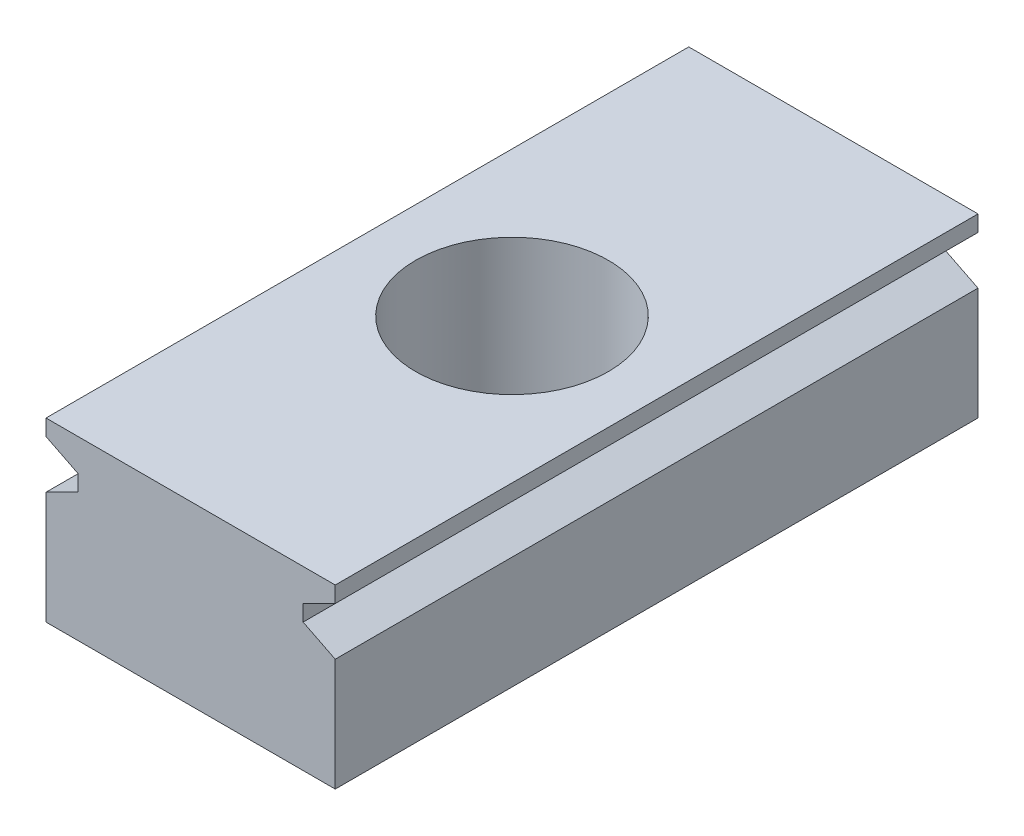
ISO-10303-21;
HEADER;
FILE_DESCRIPTION(('STEP AP214'),'2;1');
FILE_NAME('part.step','',(''),(''),'','','');
FILE_SCHEMA(('AUTOMOTIVE_DESIGN { 1 0 10303 214 1 1 1 1 }'));
ENDSEC;
DATA;
#1=APPLICATION_CONTEXT('core data for automotive mechanical design processes');
#2=APPLICATION_PROTOCOL_DEFINITION('international standard','automotive_design',2000,#1);
#3=PRODUCT_CONTEXT('',#1,'mechanical');
#4=PRODUCT('Part','Part','',(#3));
#5=PRODUCT_RELATED_PRODUCT_CATEGORY('part','',(#4));
#6=PRODUCT_DEFINITION_FORMATION('','',#4);
#7=PRODUCT_DEFINITION_CONTEXT('part definition',#1,'design');
#8=PRODUCT_DEFINITION('design','',#6,#7);
#9=PRODUCT_DEFINITION_SHAPE('','',#8);
#10=(LENGTH_UNIT() NAMED_UNIT(*) SI_UNIT(.MILLI.,.METRE.));
#11=(NAMED_UNIT(*) PLANE_ANGLE_UNIT() SI_UNIT($,.RADIAN.));
#12=(NAMED_UNIT(*) SI_UNIT($,.STERADIAN.) SOLID_ANGLE_UNIT());
#13=UNCERTAINTY_MEASURE_WITH_UNIT(LENGTH_MEASURE(1.E-05),#10,'distance_accuracy_value','');
#14=(GEOMETRIC_REPRESENTATION_CONTEXT(3) GLOBAL_UNCERTAINTY_ASSIGNED_CONTEXT((#13)) GLOBAL_UNIT_ASSIGNED_CONTEXT((#10,
#11,#12)) REPRESENTATION_CONTEXT('',''));
#15=CARTESIAN_POINT('',(0.,0.,0.));
#16=DIRECTION('',(0.,0.,1.));
#17=DIRECTION('',(1.,0.,0.));
#18=AXIS2_PLACEMENT_3D('',#15,#16,#17);
#19=CARTESIAN_POINT('',(-4.5,3.5,20.));
#20=DIRECTION('',(1.,0.,0.));
#21=DIRECTION('',(0.,1.,0.));
#22=AXIS2_PLACEMENT_3D('',#19,#20,#21);
#23=PLANE('',#22);
#24=DIRECTION('',(0.,-1.,0.));
#25=VECTOR('',#24,1.);
#26=CARTESIAN_POINT('',(-4.5,3.5,0.));
#27=LINE('',#26,#25);
#28=CARTESIAN_POINT('',(-4.5,3.5,0.));
#29=VERTEX_POINT('',#28);
#30=CARTESIAN_POINT('',(-4.5,0.,0.));
#31=VERTEX_POINT('',#30);
#32=EDGE_CURVE('E153',#29,#31,#27,.T.);
#33=ORIENTED_EDGE('',*,*,#32,.T.);
#34=DIRECTION('',(0.,0.,-1.));
#35=VECTOR('',#34,1.);
#36=CARTESIAN_POINT('',(-4.5,0.,20.));
#37=LINE('',#36,#35);
#38=CARTESIAN_POINT('',(-4.5,0.,20.));
#39=VERTEX_POINT('',#38);
#40=EDGE_CURVE('E11',#39,#31,#37,.T.);
#41=ORIENTED_EDGE('',*,*,#40,.F.);
#42=DIRECTION('',(0.,-1.,0.));
#43=VECTOR('',#42,1.);
#44=CARTESIAN_POINT('',(-4.5,3.5,20.));
#45=LINE('',#44,#43);
#46=CARTESIAN_POINT('',(-4.5,3.5,20.));
#47=VERTEX_POINT('',#46);
#48=EDGE_CURVE('E176',#47,#39,#45,.T.);
#49=ORIENTED_EDGE('',*,*,#48,.F.);
#50=DIRECTION('',(0.,0.,-1.));
#51=VECTOR('',#50,1.);
#52=CARTESIAN_POINT('',(-4.5,3.5,20.));
#53=LINE('',#52,#51);
#54=EDGE_CURVE('E149',#47,#29,#53,.T.);
#55=ORIENTED_EDGE('',*,*,#54,.T.);
#56=EDGE_LOOP('',(#33,#41,#49,#55));
#57=FACE_BOUND('',#56,.T.);
#58=ADVANCED_FACE('F33',(#57),#23,.F.);
#59=CARTESIAN_POINT('',(-4.5,0.,20.));
#60=DIRECTION('',(0.,1.,0.));
#61=DIRECTION('',(-1.,0.,0.));
#62=AXIS2_PLACEMENT_3D('',#59,#60,#61);
#63=PLANE('',#62);
#64=CARTESIAN_POINT('',(0.,0.,10.));
#65=DIRECTION('',(0.,1.,0.));
#66=DIRECTION('',(-1.,0.,0.));
#67=AXIS2_PLACEMENT_3D('',#64,#65,#66);
#68=CIRCLE('',#67,1.75);
#69=CARTESIAN_POINT('',(-1.74999999999999,0.,10.));
#70=VERTEX_POINT('',#69);
#71=EDGE_CURVE('E358',#70,#70,#68,.T.);
#72=ORIENTED_EDGE('',*,*,#71,.T.);
#73=EDGE_LOOP('',(#72));
#74=FACE_BOUND('',#73,.T.);
#75=DIRECTION('',(1.,0.,0.));
#76=VECTOR('',#75,1.);
#77=CARTESIAN_POINT('',(-4.5,0.,0.));
#78=LINE('',#77,#76);
#79=CARTESIAN_POINT('',(4.5,0.,0.));
#80=VERTEX_POINT('',#79);
#81=EDGE_CURVE('E156',#31,#80,#78,.T.);
#82=ORIENTED_EDGE('',*,*,#81,.T.);
#83=DIRECTION('',(0.,0.,-1.));
#84=VECTOR('',#83,1.);
#85=CARTESIAN_POINT('',(4.5,0.,20.));
#86=LINE('',#85,#84);
#87=CARTESIAN_POINT('',(4.5,0.,20.));
#88=VERTEX_POINT('',#87);
#89=EDGE_CURVE('E41',#88,#80,#86,.T.);
#90=ORIENTED_EDGE('',*,*,#89,.F.);
#91=DIRECTION('',(1.,0.,0.));
#92=VECTOR('',#91,1.);
#93=CARTESIAN_POINT('',(-4.5,0.,20.));
#94=LINE('',#93,#92);
#95=EDGE_CURVE('E104',#39,#88,#94,.T.);
#96=ORIENTED_EDGE('',*,*,#95,.F.);
#97=ORIENTED_EDGE('',*,*,#40,.T.);
#98=EDGE_LOOP('',(#82,#90,#96,#97));
#99=FACE_BOUND('',#98,.T.);
#100=ADVANCED_FACE('F254',(#74,#99),#63,.F.);
#101=CARTESIAN_POINT('',(4.5,0.,20.));
#102=DIRECTION('',(-1.,0.,0.));
#103=DIRECTION('',(0.,-1.,0.));
#104=AXIS2_PLACEMENT_3D('',#101,#102,#103);
#105=PLANE('',#104);
#106=DIRECTION('',(0.,1.,0.));
#107=VECTOR('',#106,1.);
#108=CARTESIAN_POINT('',(4.5,0.,0.));
#109=LINE('',#108,#107);
#110=CARTESIAN_POINT('',(4.5,3.5,0.));
#111=VERTEX_POINT('',#110);
#112=EDGE_CURVE('E159',#80,#111,#109,.T.);
#113=ORIENTED_EDGE('',*,*,#112,.T.);
#114=DIRECTION('',(0.,0.,-1.));
#115=VECTOR('',#114,1.);
#116=CARTESIAN_POINT('',(4.5,3.5,20.));
#117=LINE('',#116,#115);
#118=CARTESIAN_POINT('',(4.5,3.5,20.));
#119=VERTEX_POINT('',#118);
#120=EDGE_CURVE('E195',#119,#111,#117,.T.);
#121=ORIENTED_EDGE('',*,*,#120,.F.);
#122=DIRECTION('',(0.,1.,0.));
#123=VECTOR('',#122,1.);
#124=CARTESIAN_POINT('',(4.5,0.,20.));
#125=LINE('',#124,#123);
#126=EDGE_CURVE('E203',#88,#119,#125,.T.);
#127=ORIENTED_EDGE('',*,*,#126,.F.);
#128=ORIENTED_EDGE('',*,*,#89,.T.);
#129=EDGE_LOOP('',(#113,#121,#127,#128));
#130=FACE_BOUND('',#129,.T.);
#131=ADVANCED_FACE('F201',(#130),#105,.F.);
#132=CARTESIAN_POINT('',(4.5,3.5,20.));
#133=DIRECTION('',(-0.447213595499958,-0.894427190999916,0.));
#134=DIRECTION('',(0.894427190999916,-0.447213595499958,0.));
#135=AXIS2_PLACEMENT_3D('',#132,#133,#134);
#136=PLANE('',#135);
#137=DIRECTION('',(-0.894427190999916,0.447213595499958,0.));
#138=VECTOR('',#137,1.);
#139=CARTESIAN_POINT('',(4.5,3.5,0.));
#140=LINE('',#139,#138);
#141=CARTESIAN_POINT('',(3.5,4.,0.));
#142=VERTEX_POINT('',#141);
#143=EDGE_CURVE('E161',#111,#142,#140,.T.);
#144=ORIENTED_EDGE('',*,*,#143,.T.);
#145=DIRECTION('',(0.,0.,-1.));
#146=VECTOR('',#145,1.);
#147=CARTESIAN_POINT('',(3.5,4.,20.));
#148=LINE('',#147,#146);
#149=CARTESIAN_POINT('',(3.5,4.,20.));
#150=VERTEX_POINT('',#149);
#151=EDGE_CURVE('E192',#150,#142,#148,.T.);
#152=ORIENTED_EDGE('',*,*,#151,.F.);
#153=DIRECTION('',(-0.894427190999916,0.447213595499958,0.));
#154=VECTOR('',#153,1.);
#155=CARTESIAN_POINT('',(4.5,3.5,20.));
#156=LINE('',#155,#154);
#157=EDGE_CURVE('E221',#119,#150,#156,.T.);
#158=ORIENTED_EDGE('',*,*,#157,.F.);
#159=ORIENTED_EDGE('',*,*,#120,.T.);
#160=EDGE_LOOP('',(#144,#152,#158,#159));
#161=FACE_BOUND('',#160,.T.);
#162=ADVANCED_FACE('F212',(#161),#136,.F.);
#163=CARTESIAN_POINT('',(3.5,4.,20.));
#164=DIRECTION('',(-1.,0.,0.));
#165=DIRECTION('',(0.,-1.,0.));
#166=AXIS2_PLACEMENT_3D('',#163,#164,#165);
#167=PLANE('',#166);
#168=DIRECTION('',(0.,1.,0.));
#169=VECTOR('',#168,1.);
#170=CARTESIAN_POINT('',(3.5,4.,0.));
#171=LINE('',#170,#169);
#172=CARTESIAN_POINT('',(3.5,4.5,0.));
#173=VERTEX_POINT('',#172);
#174=EDGE_CURVE('E163',#142,#173,#171,.T.);
#175=ORIENTED_EDGE('',*,*,#174,.T.);
#176=DIRECTION('',(0.,0.,-1.));
#177=VECTOR('',#176,1.);
#178=CARTESIAN_POINT('',(3.5,4.5,20.));
#179=LINE('',#178,#177);
#180=CARTESIAN_POINT('',(3.5,4.5,20.));
#181=VERTEX_POINT('',#180);
#182=EDGE_CURVE('E189',#181,#173,#179,.T.);
#183=ORIENTED_EDGE('',*,*,#182,.F.);
#184=DIRECTION('',(0.,1.,0.));
#185=VECTOR('',#184,1.);
#186=CARTESIAN_POINT('',(3.5,4.,20.));
#187=LINE('',#186,#185);
#188=EDGE_CURVE('E218',#150,#181,#187,.T.);
#189=ORIENTED_EDGE('',*,*,#188,.F.);
#190=ORIENTED_EDGE('',*,*,#151,.T.);
#191=EDGE_LOOP('',(#175,#183,#189,#190));
#192=FACE_BOUND('',#191,.T.);
#193=ADVANCED_FACE('F216',(#192),#167,.F.);
#194=CARTESIAN_POINT('',(3.5,4.5,20.));
#195=DIRECTION('',(-0.447213595499957,0.894427190999917,0.));
#196=DIRECTION('',(-0.894427190999917,-0.447213595499957,0.));
#197=AXIS2_PLACEMENT_3D('',#194,#195,#196);
#198=PLANE('',#197);
#199=DIRECTION('',(0.894427190999916,0.447213595499957,0.));
#200=VECTOR('',#199,1.);
#201=CARTESIAN_POINT('',(3.5,4.5,0.));
#202=LINE('',#201,#200);
#203=CARTESIAN_POINT('',(4.5,5.,0.));
#204=VERTEX_POINT('',#203);
#205=EDGE_CURVE('E165',#173,#204,#202,.T.);
#206=ORIENTED_EDGE('',*,*,#205,.T.);
#207=DIRECTION('',(0.,0.,-1.));
#208=VECTOR('',#207,1.);
#209=CARTESIAN_POINT('',(4.5,5.,20.));
#210=LINE('',#209,#208);
#211=CARTESIAN_POINT('',(4.5,5.,20.));
#212=VERTEX_POINT('',#211);
#213=EDGE_CURVE('E186',#212,#204,#210,.T.);
#214=ORIENTED_EDGE('',*,*,#213,.F.);
#215=DIRECTION('',(0.894427190999916,0.447213595499957,0.));
#216=VECTOR('',#215,1.);
#217=CARTESIAN_POINT('',(3.5,4.5,20.));
#218=LINE('',#217,#216);
#219=EDGE_CURVE('E220',#181,#212,#218,.T.);
#220=ORIENTED_EDGE('',*,*,#219,.F.);
#221=ORIENTED_EDGE('',*,*,#182,.T.);
#222=EDGE_LOOP('',(#206,#214,#220,#221));
#223=FACE_BOUND('',#222,.T.);
#224=ADVANCED_FACE('F269',(#223),#198,.F.);
#225=CARTESIAN_POINT('',(4.5,5.,20.));
#226=DIRECTION('',(-1.,0.,0.));
#227=DIRECTION('',(0.,-1.,0.));
#228=AXIS2_PLACEMENT_3D('',#225,#226,#227);
#229=PLANE('',#228);
#230=DIRECTION('',(0.,1.,0.));
#231=VECTOR('',#230,1.);
#232=CARTESIAN_POINT('',(4.5,5.,0.));
#233=LINE('',#232,#231);
#234=CARTESIAN_POINT('',(4.5,5.5,0.));
#235=VERTEX_POINT('',#234);
#236=EDGE_CURVE('E167',#204,#235,#233,.T.);
#237=ORIENTED_EDGE('',*,*,#236,.T.);
#238=DIRECTION('',(0.,0.,-1.));
#239=VECTOR('',#238,1.);
#240=CARTESIAN_POINT('',(4.5,5.5,20.));
#241=LINE('',#240,#239);
#242=CARTESIAN_POINT('',(4.5,5.5,20.));
#243=VERTEX_POINT('',#242);
#244=EDGE_CURVE('E183',#243,#235,#241,.T.);
#245=ORIENTED_EDGE('',*,*,#244,.F.);
#246=DIRECTION('',(0.,1.,0.));
#247=VECTOR('',#246,1.);
#248=CARTESIAN_POINT('',(4.5,5.,20.));
#249=LINE('',#248,#247);
#250=EDGE_CURVE('E223',#212,#243,#249,.T.);
#251=ORIENTED_EDGE('',*,*,#250,.F.);
#252=ORIENTED_EDGE('',*,*,#213,.T.);
#253=EDGE_LOOP('',(#237,#245,#251,#252));
#254=FACE_BOUND('',#253,.T.);
#255=ADVANCED_FACE('F272',(#254),#229,.F.);
#256=CARTESIAN_POINT('',(4.5,5.5,20.));
#257=DIRECTION('',(0.,-1.,0.));
#258=DIRECTION('',(1.,0.,0.));
#259=AXIS2_PLACEMENT_3D('',#256,#257,#258);
#260=PLANE('',#259);
#261=CARTESIAN_POINT('',(0.,5.5,10.));
#262=DIRECTION('',(0.,1.,0.));
#263=DIRECTION('',(-1.,0.,0.));
#264=AXIS2_PLACEMENT_3D('',#261,#262,#263);
#265=CIRCLE('',#264,3.);
#266=CARTESIAN_POINT('',(-3.,5.5,10.));
#267=VERTEX_POINT('',#266);
#268=EDGE_CURVE('E363',#267,#267,#265,.T.);
#269=ORIENTED_EDGE('',*,*,#268,.F.);
#270=EDGE_LOOP('',(#269));
#271=FACE_BOUND('',#270,.T.);
#272=DIRECTION('',(-1.,0.,0.));
#273=VECTOR('',#272,1.);
#274=CARTESIAN_POINT('',(4.5,5.5,0.));
#275=LINE('',#274,#273);
#276=CARTESIAN_POINT('',(-4.5,5.5,0.));
#277=VERTEX_POINT('',#276);
#278=EDGE_CURVE('E169',#235,#277,#275,.T.);
#279=ORIENTED_EDGE('',*,*,#278,.T.);
#280=DIRECTION('',(0.,0.,-1.));
#281=VECTOR('',#280,1.);
#282=CARTESIAN_POINT('',(-4.5,5.5,20.));
#283=LINE('',#282,#281);
#284=CARTESIAN_POINT('',(-4.5,5.5,20.));
#285=VERTEX_POINT('',#284);
#286=EDGE_CURVE('E180',#285,#277,#283,.T.);
#287=ORIENTED_EDGE('',*,*,#286,.F.);
#288=DIRECTION('',(-1.,0.,0.));
#289=VECTOR('',#288,1.);
#290=CARTESIAN_POINT('',(4.5,5.5,20.));
#291=LINE('',#290,#289);
#292=EDGE_CURVE('E229',#243,#285,#291,.T.);
#293=ORIENTED_EDGE('',*,*,#292,.F.);
#294=ORIENTED_EDGE('',*,*,#244,.T.);
#295=EDGE_LOOP('',(#279,#287,#293,#294));
#296=FACE_BOUND('',#295,.T.);
#297=ADVANCED_FACE('F235',(#271,#296),#260,.F.);
#298=CARTESIAN_POINT('',(-4.5,5.5,20.));
#299=DIRECTION('',(1.,0.,0.));
#300=DIRECTION('',(0.,1.,0.));
#301=AXIS2_PLACEMENT_3D('',#298,#299,#300);
#302=PLANE('',#301);
#303=DIRECTION('',(0.,-1.,0.));
#304=VECTOR('',#303,1.);
#305=CARTESIAN_POINT('',(-4.5,5.5,0.));
#306=LINE('',#305,#304);
#307=CARTESIAN_POINT('',(-4.5,5.,0.));
#308=VERTEX_POINT('',#307);
#309=EDGE_CURVE('E171',#277,#308,#306,.T.);
#310=ORIENTED_EDGE('',*,*,#309,.T.);
#311=DIRECTION('',(0.,0.,-1.));
#312=VECTOR('',#311,1.);
#313=CARTESIAN_POINT('',(-4.5,5.,20.));
#314=LINE('',#313,#312);
#315=CARTESIAN_POINT('',(-4.5,5.,20.));
#316=VERTEX_POINT('',#315);
#317=EDGE_CURVE('E144',#316,#308,#314,.T.);
#318=ORIENTED_EDGE('',*,*,#317,.F.);
#319=DIRECTION('',(0.,-1.,0.));
#320=VECTOR('',#319,1.);
#321=CARTESIAN_POINT('',(-4.5,5.5,20.));
#322=LINE('',#321,#320);
#323=EDGE_CURVE('E135',#285,#316,#322,.T.);
#324=ORIENTED_EDGE('',*,*,#323,.F.);
#325=ORIENTED_EDGE('',*,*,#286,.T.);
#326=EDGE_LOOP('',(#310,#318,#324,#325));
#327=FACE_BOUND('',#326,.T.);
#328=ADVANCED_FACE('F239',(#327),#302,.F.);
#329=CARTESIAN_POINT('',(-4.5,5.,20.));
#330=DIRECTION('',(0.447213595499957,0.894427190999917,0.));
#331=DIRECTION('',(-0.894427190999917,0.447213595499957,0.));
#332=AXIS2_PLACEMENT_3D('',#329,#330,#331);
#333=PLANE('',#332);
#334=DIRECTION('',(0.894427190999916,-0.447213595499957,0.));
#335=VECTOR('',#334,1.);
#336=CARTESIAN_POINT('',(-4.5,5.,0.));
#337=LINE('',#336,#335);
#338=CARTESIAN_POINT('',(-3.5,4.5,0.));
#339=VERTEX_POINT('',#338);
#340=EDGE_CURVE('E143',#308,#339,#337,.T.);
#341=ORIENTED_EDGE('',*,*,#340,.T.);
#342=DIRECTION('',(0.,0.,-1.));
#343=VECTOR('',#342,1.);
#344=CARTESIAN_POINT('',(-3.5,4.5,20.));
#345=LINE('',#344,#343);
#346=CARTESIAN_POINT('',(-3.5,4.5,20.));
#347=VERTEX_POINT('',#346);
#348=EDGE_CURVE('E140',#347,#339,#345,.T.);
#349=ORIENTED_EDGE('',*,*,#348,.F.);
#350=DIRECTION('',(0.894427190999916,-0.447213595499957,0.));
#351=VECTOR('',#350,1.);
#352=CARTESIAN_POINT('',(-4.5,5.,20.));
#353=LINE('',#352,#351);
#354=EDGE_CURVE('E129',#316,#347,#353,.T.);
#355=ORIENTED_EDGE('',*,*,#354,.F.);
#356=ORIENTED_EDGE('',*,*,#317,.T.);
#357=EDGE_LOOP('',(#341,#349,#355,#356));
#358=FACE_BOUND('',#357,.T.);
#359=ADVANCED_FACE('F141',(#358),#333,.F.);
#360=CARTESIAN_POINT('',(-3.5,4.5,20.));
#361=DIRECTION('',(1.,0.,0.));
#362=DIRECTION('',(0.,1.,0.));
#363=AXIS2_PLACEMENT_3D('',#360,#361,#362);
#364=PLANE('',#363);
#365=DIRECTION('',(0.,-1.,0.));
#366=VECTOR('',#365,1.);
#367=CARTESIAN_POINT('',(-3.5,4.5,0.));
#368=LINE('',#367,#366);
#369=CARTESIAN_POINT('',(-3.5,4.,0.));
#370=VERTEX_POINT('',#369);
#371=EDGE_CURVE('E90',#339,#370,#368,.T.);
#372=ORIENTED_EDGE('',*,*,#371,.T.);
#373=DIRECTION('',(0.,0.,-1.));
#374=VECTOR('',#373,1.);
#375=CARTESIAN_POINT('',(-3.5,4.,20.));
#376=LINE('',#375,#374);
#377=CARTESIAN_POINT('',(-3.5,4.,20.));
#378=VERTEX_POINT('',#377);
#379=EDGE_CURVE('E145',#378,#370,#376,.T.);
#380=ORIENTED_EDGE('',*,*,#379,.F.);
#381=DIRECTION('',(0.,-1.,0.));
#382=VECTOR('',#381,1.);
#383=CARTESIAN_POINT('',(-3.5,4.5,20.));
#384=LINE('',#383,#382);
#385=EDGE_CURVE('E133',#347,#378,#384,.T.);
#386=ORIENTED_EDGE('',*,*,#385,.F.);
#387=ORIENTED_EDGE('',*,*,#348,.T.);
#388=EDGE_LOOP('',(#372,#380,#386,#387));
#389=FACE_BOUND('',#388,.T.);
#390=ADVANCED_FACE('F147',(#389),#364,.F.);
#391=CARTESIAN_POINT('',(-3.5,4.,20.));
#392=DIRECTION('',(0.447213595499958,-0.894427190999916,0.));
#393=DIRECTION('',(0.894427190999916,0.447213595499958,0.));
#394=AXIS2_PLACEMENT_3D('',#391,#392,#393);
#395=PLANE('',#394);
#396=DIRECTION('',(-0.894427190999916,-0.447213595499958,0.));
#397=VECTOR('',#396,1.);
#398=CARTESIAN_POINT('',(-3.5,4.,0.));
#399=LINE('',#398,#397);
#400=EDGE_CURVE('E96',#370,#29,#399,.T.);
#401=ORIENTED_EDGE('',*,*,#400,.T.);
#402=ORIENTED_EDGE('',*,*,#54,.F.);
#403=DIRECTION('',(-0.894427190999916,-0.447213595499958,0.));
#404=VECTOR('',#403,1.);
#405=CARTESIAN_POINT('',(-3.5,4.,20.));
#406=LINE('',#405,#404);
#407=EDGE_CURVE('E49',#378,#47,#406,.T.);
#408=ORIENTED_EDGE('',*,*,#407,.F.);
#409=ORIENTED_EDGE('',*,*,#379,.T.);
#410=EDGE_LOOP('',(#401,#402,#408,#409));
#411=FACE_BOUND('',#410,.T.);
#412=ADVANCED_FACE('F243',(#411),#395,.F.);
#413=CARTESIAN_POINT('',(0.,0.,20.));
#414=DIRECTION('',(0.,0.,1.));
#415=DIRECTION('',(1.,0.,0.));
#416=AXIS2_PLACEMENT_3D('',#413,#414,#415);
#417=PLANE('',#416);
#418=ORIENTED_EDGE('',*,*,#48,.T.);
#419=ORIENTED_EDGE('',*,*,#95,.T.);
#420=ORIENTED_EDGE('',*,*,#126,.T.);
#421=ORIENTED_EDGE('',*,*,#157,.T.);
#422=ORIENTED_EDGE('',*,*,#188,.T.);
#423=ORIENTED_EDGE('',*,*,#219,.T.);
#424=ORIENTED_EDGE('',*,*,#250,.T.);
#425=ORIENTED_EDGE('',*,*,#292,.T.);
#426=ORIENTED_EDGE('',*,*,#323,.T.);
#427=ORIENTED_EDGE('',*,*,#354,.T.);
#428=ORIENTED_EDGE('',*,*,#385,.T.);
#429=ORIENTED_EDGE('',*,*,#407,.T.);
#430=EDGE_LOOP('',(#418,#419,#420,#421,#422,#423,#424,#425,#426,#427,#428,#429));
#431=FACE_BOUND('',#430,.T.);
#432=ADVANCED_FACE('F131',(#431),#417,.T.);
#433=CARTESIAN_POINT('',(0.,0.,0.));
#434=DIRECTION('',(0.,0.,1.));
#435=DIRECTION('',(1.,0.,0.));
#436=AXIS2_PLACEMENT_3D('',#433,#434,#435);
#437=PLANE('',#436);
#438=ORIENTED_EDGE('',*,*,#32,.F.);
#439=ORIENTED_EDGE('',*,*,#400,.F.);
#440=ORIENTED_EDGE('',*,*,#371,.F.);
#441=ORIENTED_EDGE('',*,*,#340,.F.);
#442=ORIENTED_EDGE('',*,*,#309,.F.);
#443=ORIENTED_EDGE('',*,*,#278,.F.);
#444=ORIENTED_EDGE('',*,*,#236,.F.);
#445=ORIENTED_EDGE('',*,*,#205,.F.);
#446=ORIENTED_EDGE('',*,*,#174,.F.);
#447=ORIENTED_EDGE('',*,*,#143,.F.);
#448=ORIENTED_EDGE('',*,*,#112,.F.);
#449=ORIENTED_EDGE('',*,*,#81,.F.);
#450=EDGE_LOOP('',(#438,#439,#440,#441,#442,#443,#444,#445,#446,#447,#448,#449));
#451=FACE_BOUND('',#450,.T.);
#452=ADVANCED_FACE('F207',(#451),#437,.F.);
#453=CARTESIAN_POINT('',(0.,0.999999999999999,10.));
#454=DIRECTION('',(0.,1.,0.));
#455=DIRECTION('',(-1.,0.,0.));
#456=AXIS2_PLACEMENT_3D('',#453,#454,#455);
#457=CYLINDRICAL_SURFACE('',#456,3.);
#458=CARTESIAN_POINT('',(0.,0.999999999999999,10.));
#459=DIRECTION('',(0.,1.,0.));
#460=DIRECTION('',(-1.,0.,0.));
#461=AXIS2_PLACEMENT_3D('',#458,#459,#460);
#462=CIRCLE('',#461,3.);
#463=CARTESIAN_POINT('',(-2.99999999999999,0.999999999999997,10.));
#464=VERTEX_POINT('',#463);
#465=EDGE_CURVE('E157',#464,#464,#462,.T.);
#466=ORIENTED_EDGE('',*,*,#465,.F.);
#467=EDGE_LOOP('',(#466));
#468=FACE_BOUND('',#467,.T.);
#469=ORIENTED_EDGE('',*,*,#268,.T.);
#470=EDGE_LOOP('',(#469));
#471=FACE_BOUND('',#470,.T.);
#472=ADVANCED_FACE('F310',(#468,#471),#457,.F.);
#473=CARTESIAN_POINT('',(0.,0.999999999999999,10.));
#474=DIRECTION('',(0.,1.,0.));
#475=DIRECTION('',(-1.,0.,0.));
#476=AXIS2_PLACEMENT_3D('',#473,#474,#475);
#477=PLANE('',#476);
#478=CARTESIAN_POINT('',(0.,0.999999999999999,10.));
#479=DIRECTION('',(0.,1.,0.));
#480=DIRECTION('',(-1.,0.,0.));
#481=AXIS2_PLACEMENT_3D('',#478,#479,#480);
#482=CIRCLE('',#481,1.75);
#483=CARTESIAN_POINT('',(-1.74999999999999,0.999999999999998,10.));
#484=VERTEX_POINT('',#483);
#485=EDGE_CURVE('E361',#484,#484,#482,.T.);
#486=ORIENTED_EDGE('',*,*,#485,.F.);
#487=EDGE_LOOP('',(#486));
#488=FACE_BOUND('',#487,.T.);
#489=ORIENTED_EDGE('',*,*,#465,.T.);
#490=EDGE_LOOP('',(#489));
#491=FACE_BOUND('',#490,.T.);
#492=ADVANCED_FACE('F325',(#488,#491),#477,.T.);
#493=CARTESIAN_POINT('',(0.,0.,10.));
#494=DIRECTION('',(0.,1.,0.));
#495=DIRECTION('',(-1.,0.,0.));
#496=AXIS2_PLACEMENT_3D('',#493,#494,#495);
#497=CYLINDRICAL_SURFACE('',#496,1.75);
#498=ORIENTED_EDGE('',*,*,#71,.F.);
#499=EDGE_LOOP('',(#498));
#500=FACE_BOUND('',#499,.T.);
#501=ORIENTED_EDGE('',*,*,#485,.T.);
#502=EDGE_LOOP('',(#501));
#503=FACE_BOUND('',#502,.T.);
#504=ADVANCED_FACE('F342',(#500,#503),#497,.F.);
#505=CLOSED_SHELL('',(#58,#100,#131,#162,#193,#224,#255,#297,#328,#359,#390,#412,#432,#452,#472,
#492,#504));
#506=MANIFOLD_SOLID_BREP('B2',#505);
#507=ADVANCED_BREP_SHAPE_REPRESENTATION('',(#18,#506),#14);
#508=SHAPE_DEFINITION_REPRESENTATION(#9,#507);
ENDSEC;
END-ISO-10303-21;
